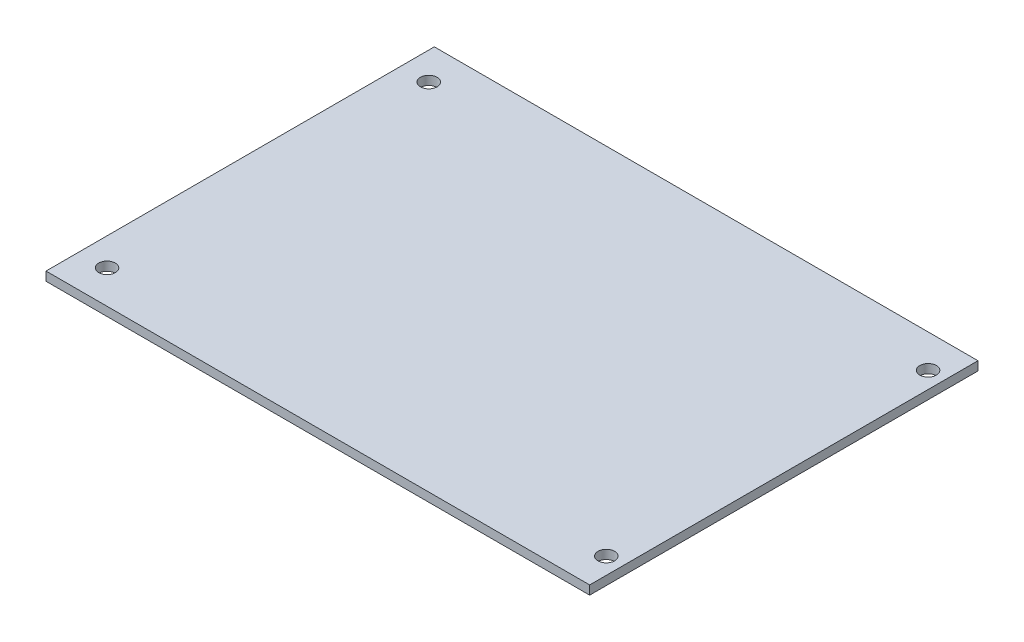
ISO-10303-21;
HEADER;
FILE_DESCRIPTION(('STEP AP214'),'2;1');
FILE_NAME('part.step','',(''),(''),'','','');
FILE_SCHEMA(('AUTOMOTIVE_DESIGN { 1 0 10303 214 1 1 1 1 }'));
ENDSEC;
DATA;
#1=APPLICATION_CONTEXT('core data for automotive mechanical design processes');
#2=APPLICATION_PROTOCOL_DEFINITION('international standard','automotive_design',2000,#1);
#3=PRODUCT_CONTEXT('',#1,'mechanical');
#4=PRODUCT('Part','Part','',(#3));
#5=PRODUCT_RELATED_PRODUCT_CATEGORY('part','',(#4));
#6=PRODUCT_DEFINITION_FORMATION('','',#4);
#7=PRODUCT_DEFINITION_CONTEXT('part definition',#1,'design');
#8=PRODUCT_DEFINITION('design','',#6,#7);
#9=PRODUCT_DEFINITION_SHAPE('','',#8);
#10=(LENGTH_UNIT() NAMED_UNIT(*) SI_UNIT(.MILLI.,.METRE.));
#11=(NAMED_UNIT(*) PLANE_ANGLE_UNIT() SI_UNIT($,.RADIAN.));
#12=(NAMED_UNIT(*) SI_UNIT($,.STERADIAN.) SOLID_ANGLE_UNIT());
#13=UNCERTAINTY_MEASURE_WITH_UNIT(LENGTH_MEASURE(1.E-05),#10,'distance_accuracy_value','');
#14=(GEOMETRIC_REPRESENTATION_CONTEXT(3) GLOBAL_UNCERTAINTY_ASSIGNED_CONTEXT((#13)) GLOBAL_UNIT_ASSIGNED_CONTEXT((#10,
#11,#12)) REPRESENTATION_CONTEXT('',''));
#15=CARTESIAN_POINT('',(0.,0.,0.));
#16=DIRECTION('',(0.,0.,1.));
#17=DIRECTION('',(1.,0.,0.));
#18=AXIS2_PLACEMENT_3D('',#15,#16,#17);
#19=CARTESIAN_POINT('',(0.,1.6,0.));
#20=DIRECTION('',(0.,-1.,0.));
#21=DIRECTION('',(0.,0.,-1.));
#22=AXIS2_PLACEMENT_3D('',#19,#20,#21);
#23=PLANE('',#22);
#24=DIRECTION('',(0.,0.,-1.));
#25=VECTOR('',#24,1.);
#26=CARTESIAN_POINT('',(49.,1.6,35.));
#27=LINE('',#26,#25);
#28=CARTESIAN_POINT('',(49.,1.6,35.));
#29=VERTEX_POINT('',#28);
#30=CARTESIAN_POINT('',(49.,1.6,-35.));
#31=VERTEX_POINT('',#30);
#32=EDGE_CURVE('E92',#29,#31,#27,.T.);
#33=ORIENTED_EDGE('',*,*,#32,.T.);
#34=DIRECTION('',(-1.,0.,0.));
#35=VECTOR('',#34,1.);
#36=CARTESIAN_POINT('',(-49.,1.6,-35.));
#37=LINE('',#36,#35);
#38=CARTESIAN_POINT('',(-49.,1.6,-35.));
#39=VERTEX_POINT('',#38);
#40=EDGE_CURVE('E87',#31,#39,#37,.T.);
#41=ORIENTED_EDGE('',*,*,#40,.T.);
#42=DIRECTION('',(0.,0.,1.));
#43=VECTOR('',#42,1.);
#44=CARTESIAN_POINT('',(-49.,1.6,35.));
#45=LINE('',#44,#43);
#46=CARTESIAN_POINT('',(-49.,1.6,35.));
#47=VERTEX_POINT('',#46);
#48=EDGE_CURVE('E90',#39,#47,#45,.T.);
#49=ORIENTED_EDGE('',*,*,#48,.T.);
#50=DIRECTION('',(1.,0.,0.));
#51=VECTOR('',#50,1.);
#52=CARTESIAN_POINT('',(-49.,1.6,35.));
#53=LINE('',#52,#51);
#54=EDGE_CURVE('E57',#47,#29,#53,.T.);
#55=ORIENTED_EDGE('',*,*,#54,.T.);
#56=EDGE_LOOP('',(#33,#41,#49,#55));
#57=FACE_BOUND('',#56,.T.);
#58=CARTESIAN_POINT('',(-44.,1.6,-29.));
#59=DIRECTION('',(0.,1.,0.));
#60=DIRECTION('',(0.,0.,1.));
#61=AXIS2_PLACEMENT_3D('',#58,#59,#60);
#62=CIRCLE('',#61,1.5);
#63=CARTESIAN_POINT('',(-44.,1.6,-27.5));
#64=VERTEX_POINT('',#63);
#65=EDGE_CURVE('E112',#64,#64,#62,.T.);
#66=ORIENTED_EDGE('',*,*,#65,.F.);
#67=EDGE_LOOP('',(#66));
#68=FACE_BOUND('',#67,.T.);
#69=CARTESIAN_POINT('',(-44.,1.6,29.));
#70=DIRECTION('',(0.,1.,0.));
#71=DIRECTION('',(0.,0.,-1.));
#72=AXIS2_PLACEMENT_3D('',#69,#70,#71);
#73=CIRCLE('',#72,1.5);
#74=CARTESIAN_POINT('',(-44.,1.6,27.5));
#75=VERTEX_POINT('',#74);
#76=EDGE_CURVE('E134',#75,#75,#73,.T.);
#77=ORIENTED_EDGE('',*,*,#76,.F.);
#78=EDGE_LOOP('',(#77));
#79=FACE_BOUND('',#78,.T.);
#80=CARTESIAN_POINT('',(46.,1.6,-29.));
#81=DIRECTION('',(0.,1.,0.));
#82=DIRECTION('',(0.,0.,1.));
#83=AXIS2_PLACEMENT_3D('',#80,#81,#82);
#84=CIRCLE('',#83,1.5);
#85=CARTESIAN_POINT('',(46.,1.6,-27.5));
#86=VERTEX_POINT('',#85);
#87=EDGE_CURVE('E142',#86,#86,#84,.T.);
#88=ORIENTED_EDGE('',*,*,#87,.F.);
#89=EDGE_LOOP('',(#88));
#90=FACE_BOUND('',#89,.T.);
#91=CARTESIAN_POINT('',(46.,1.6,29.));
#92=DIRECTION('',(0.,1.,0.));
#93=DIRECTION('',(0.,0.,-1.));
#94=AXIS2_PLACEMENT_3D('',#91,#92,#93);
#95=CIRCLE('',#94,1.5);
#96=CARTESIAN_POINT('',(46.,1.6,27.5));
#97=VERTEX_POINT('',#96);
#98=EDGE_CURVE('E150',#97,#97,#95,.T.);
#99=ORIENTED_EDGE('',*,*,#98,.F.);
#100=EDGE_LOOP('',(#99));
#101=FACE_BOUND('',#100,.T.);
#102=ADVANCED_FACE('F39',(#57,#68,#79,#90,#101),#23,.F.);
#103=CARTESIAN_POINT('',(0.,0.,0.));
#104=DIRECTION('',(0.,-1.,0.));
#105=DIRECTION('',(0.,0.,-1.));
#106=AXIS2_PLACEMENT_3D('',#103,#104,#105);
#107=PLANE('',#106);
#108=CARTESIAN_POINT('',(46.,0.,-29.));
#109=DIRECTION('',(0.,1.,0.));
#110=DIRECTION('',(0.,0.,1.));
#111=AXIS2_PLACEMENT_3D('',#108,#109,#110);
#112=CIRCLE('',#111,1.5);
#113=CARTESIAN_POINT('',(46.,0.,-27.5));
#114=VERTEX_POINT('',#113);
#115=EDGE_CURVE('E146',#114,#114,#112,.T.);
#116=ORIENTED_EDGE('',*,*,#115,.T.);
#117=EDGE_LOOP('',(#116));
#118=FACE_BOUND('',#117,.T.);
#119=CARTESIAN_POINT('',(-44.,0.,-29.));
#120=DIRECTION('',(0.,1.,0.));
#121=DIRECTION('',(0.,0.,1.));
#122=AXIS2_PLACEMENT_3D('',#119,#120,#121);
#123=CIRCLE('',#122,1.5);
#124=CARTESIAN_POINT('',(-44.,0.,-27.5));
#125=VERTEX_POINT('',#124);
#126=EDGE_CURVE('E130',#125,#125,#123,.T.);
#127=ORIENTED_EDGE('',*,*,#126,.T.);
#128=EDGE_LOOP('',(#127));
#129=FACE_BOUND('',#128,.T.);
#130=DIRECTION('',(0.,0.,-1.));
#131=VECTOR('',#130,1.);
#132=CARTESIAN_POINT('',(49.,0.,35.));
#133=LINE('',#132,#131);
#134=CARTESIAN_POINT('',(49.,0.,35.));
#135=VERTEX_POINT('',#134);
#136=CARTESIAN_POINT('',(49.,0.,-35.));
#137=VERTEX_POINT('',#136);
#138=EDGE_CURVE('E108',#135,#137,#133,.T.);
#139=ORIENTED_EDGE('',*,*,#138,.F.);
#140=DIRECTION('',(1.,0.,0.));
#141=VECTOR('',#140,1.);
#142=CARTESIAN_POINT('',(-49.,0.,35.));
#143=LINE('',#142,#141);
#144=CARTESIAN_POINT('',(-49.,0.,35.));
#145=VERTEX_POINT('',#144);
#146=EDGE_CURVE('E80',#145,#135,#143,.T.);
#147=ORIENTED_EDGE('',*,*,#146,.F.);
#148=DIRECTION('',(0.,0.,1.));
#149=VECTOR('',#148,1.);
#150=CARTESIAN_POINT('',(-49.,0.,35.));
#151=LINE('',#150,#149);
#152=CARTESIAN_POINT('',(-49.,0.,-35.));
#153=VERTEX_POINT('',#152);
#154=EDGE_CURVE('E74',#153,#145,#151,.T.);
#155=ORIENTED_EDGE('',*,*,#154,.F.);
#156=DIRECTION('',(-1.,0.,0.));
#157=VECTOR('',#156,1.);
#158=CARTESIAN_POINT('',(-49.,0.,-35.));
#159=LINE('',#158,#157);
#160=EDGE_CURVE('E97',#137,#153,#159,.T.);
#161=ORIENTED_EDGE('',*,*,#160,.F.);
#162=EDGE_LOOP('',(#139,#147,#155,#161));
#163=FACE_BOUND('',#162,.T.);
#164=CARTESIAN_POINT('',(-44.,0.,29.));
#165=DIRECTION('',(0.,1.,0.));
#166=DIRECTION('',(0.,0.,-1.));
#167=AXIS2_PLACEMENT_3D('',#164,#165,#166);
#168=CIRCLE('',#167,1.5);
#169=CARTESIAN_POINT('',(-44.,0.,27.5));
#170=VERTEX_POINT('',#169);
#171=EDGE_CURVE('E138',#170,#170,#168,.T.);
#172=ORIENTED_EDGE('',*,*,#171,.T.);
#173=EDGE_LOOP('',(#172));
#174=FACE_BOUND('',#173,.T.);
#175=CARTESIAN_POINT('',(46.,0.,29.));
#176=DIRECTION('',(0.,1.,0.));
#177=DIRECTION('',(0.,0.,-1.));
#178=AXIS2_PLACEMENT_3D('',#175,#176,#177);
#179=CIRCLE('',#178,1.5);
#180=CARTESIAN_POINT('',(46.,0.,27.5));
#181=VERTEX_POINT('',#180);
#182=EDGE_CURVE('E154',#181,#181,#179,.T.);
#183=ORIENTED_EDGE('',*,*,#182,.T.);
#184=EDGE_LOOP('',(#183));
#185=FACE_BOUND('',#184,.T.);
#186=ADVANCED_FACE('F125',(#118,#129,#163,#174,#185),#107,.T.);
#187=CARTESIAN_POINT('',(49.,1.6,35.));
#188=DIRECTION('',(-1.,0.,0.));
#189=DIRECTION('',(0.,0.,1.));
#190=AXIS2_PLACEMENT_3D('',#187,#188,#189);
#191=PLANE('',#190);
#192=ORIENTED_EDGE('',*,*,#138,.T.);
#193=DIRECTION('',(0.,-1.,0.));
#194=VECTOR('',#193,1.);
#195=CARTESIAN_POINT('',(49.,1.6,-35.));
#196=LINE('',#195,#194);
#197=EDGE_CURVE('E11',#31,#137,#196,.T.);
#198=ORIENTED_EDGE('',*,*,#197,.F.);
#199=ORIENTED_EDGE('',*,*,#32,.F.);
#200=DIRECTION('',(0.,-1.,0.));
#201=VECTOR('',#200,1.);
#202=CARTESIAN_POINT('',(49.,1.6,35.));
#203=LINE('',#202,#201);
#204=EDGE_CURVE('E104',#29,#135,#203,.T.);
#205=ORIENTED_EDGE('',*,*,#204,.T.);
#206=EDGE_LOOP('',(#192,#198,#199,#205));
#207=FACE_BOUND('',#206,.T.);
#208=ADVANCED_FACE('F41',(#207),#191,.F.);
#209=CARTESIAN_POINT('',(-49.,1.6,-35.));
#210=DIRECTION('',(0.,0.,1.));
#211=DIRECTION('',(1.,0.,0.));
#212=AXIS2_PLACEMENT_3D('',#209,#210,#211);
#213=PLANE('',#212);
#214=ORIENTED_EDGE('',*,*,#160,.T.);
#215=DIRECTION('',(0.,-1.,0.));
#216=VECTOR('',#215,1.);
#217=CARTESIAN_POINT('',(-49.,1.6,-35.));
#218=LINE('',#217,#216);
#219=EDGE_CURVE('E49',#39,#153,#218,.T.);
#220=ORIENTED_EDGE('',*,*,#219,.F.);
#221=ORIENTED_EDGE('',*,*,#40,.F.);
#222=ORIENTED_EDGE('',*,*,#197,.T.);
#223=EDGE_LOOP('',(#214,#220,#221,#222));
#224=FACE_BOUND('',#223,.T.);
#225=ADVANCED_FACE('F96',(#224),#213,.F.);
#226=CARTESIAN_POINT('',(-49.,1.6,35.));
#227=DIRECTION('',(1.,0.,0.));
#228=DIRECTION('',(0.,0.,-1.));
#229=AXIS2_PLACEMENT_3D('',#226,#227,#228);
#230=PLANE('',#229);
#231=ORIENTED_EDGE('',*,*,#154,.T.);
#232=DIRECTION('',(0.,-1.,0.));
#233=VECTOR('',#232,1.);
#234=CARTESIAN_POINT('',(-49.,1.6,35.));
#235=LINE('',#234,#233);
#236=EDGE_CURVE('E99',#47,#145,#235,.T.);
#237=ORIENTED_EDGE('',*,*,#236,.F.);
#238=ORIENTED_EDGE('',*,*,#48,.F.);
#239=ORIENTED_EDGE('',*,*,#219,.T.);
#240=EDGE_LOOP('',(#231,#237,#238,#239));
#241=FACE_BOUND('',#240,.T.);
#242=ADVANCED_FACE('F100',(#241),#230,.F.);
#243=CARTESIAN_POINT('',(-49.,1.6,35.));
#244=DIRECTION('',(0.,0.,-1.));
#245=DIRECTION('',(-1.,0.,0.));
#246=AXIS2_PLACEMENT_3D('',#243,#244,#245);
#247=PLANE('',#246);
#248=ORIENTED_EDGE('',*,*,#146,.T.);
#249=ORIENTED_EDGE('',*,*,#204,.F.);
#250=ORIENTED_EDGE('',*,*,#54,.F.);
#251=ORIENTED_EDGE('',*,*,#236,.T.);
#252=EDGE_LOOP('',(#248,#249,#250,#251));
#253=FACE_BOUND('',#252,.T.);
#254=ADVANCED_FACE('F122',(#253),#247,.F.);
#255=CARTESIAN_POINT('',(-44.,1.6,-29.));
#256=DIRECTION('',(0.,-1.,0.));
#257=DIRECTION('',(0.,0.,-1.));
#258=AXIS2_PLACEMENT_3D('',#255,#256,#257);
#259=CYLINDRICAL_SURFACE('',#258,1.5);
#260=ORIENTED_EDGE('',*,*,#65,.T.);
#261=EDGE_LOOP('',(#260));
#262=FACE_BOUND('',#261,.T.);
#263=ORIENTED_EDGE('',*,*,#126,.F.);
#264=EDGE_LOOP('',(#263));
#265=FACE_BOUND('',#264,.T.);
#266=ADVANCED_FACE('F173',(#262,#265),#259,.F.);
#267=CARTESIAN_POINT('',(-44.,1.6,29.));
#268=DIRECTION('',(0.,-1.,0.));
#269=DIRECTION('',(0.,0.,-1.));
#270=AXIS2_PLACEMENT_3D('',#267,#268,#269);
#271=CYLINDRICAL_SURFACE('',#270,1.5);
#272=ORIENTED_EDGE('',*,*,#76,.T.);
#273=EDGE_LOOP('',(#272));
#274=FACE_BOUND('',#273,.T.);
#275=ORIENTED_EDGE('',*,*,#171,.F.);
#276=EDGE_LOOP('',(#275));
#277=FACE_BOUND('',#276,.T.);
#278=ADVANCED_FACE('F219',(#274,#277),#271,.F.);
#279=CARTESIAN_POINT('',(46.,1.6,-29.));
#280=DIRECTION('',(0.,-1.,0.));
#281=DIRECTION('',(0.,0.,-1.));
#282=AXIS2_PLACEMENT_3D('',#279,#280,#281);
#283=CYLINDRICAL_SURFACE('',#282,1.5);
#284=ORIENTED_EDGE('',*,*,#87,.T.);
#285=EDGE_LOOP('',(#284));
#286=FACE_BOUND('',#285,.T.);
#287=ORIENTED_EDGE('',*,*,#115,.F.);
#288=EDGE_LOOP('',(#287));
#289=FACE_BOUND('',#288,.T.);
#290=ADVANCED_FACE('F227',(#286,#289),#283,.F.);
#291=CARTESIAN_POINT('',(46.,1.6,29.));
#292=DIRECTION('',(0.,-1.,0.));
#293=DIRECTION('',(0.,0.,-1.));
#294=AXIS2_PLACEMENT_3D('',#291,#292,#293);
#295=CYLINDRICAL_SURFACE('',#294,1.5);
#296=ORIENTED_EDGE('',*,*,#98,.T.);
#297=EDGE_LOOP('',(#296));
#298=FACE_BOUND('',#297,.T.);
#299=ORIENTED_EDGE('',*,*,#182,.F.);
#300=EDGE_LOOP('',(#299));
#301=FACE_BOUND('',#300,.T.);
#302=ADVANCED_FACE('F162',(#298,#301),#295,.F.);
#303=CLOSED_SHELL('',(#102,#186,#208,#225,#242,#254,#266,#278,#290,#302));
#304=MANIFOLD_SOLID_BREP('B2',#303);
#305=ADVANCED_BREP_SHAPE_REPRESENTATION('',(#18,#304),#14);
#306=SHAPE_DEFINITION_REPRESENTATION(#9,#305);
ENDSEC;
END-ISO-10303-21;
